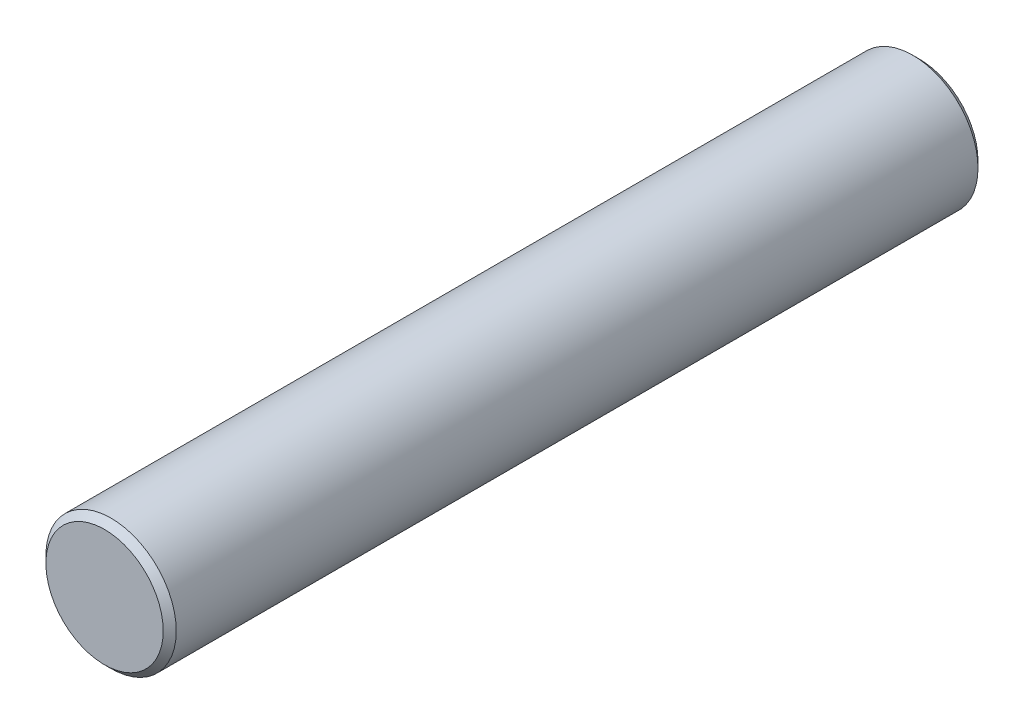
ISO-10303-21;
HEADER;
FILE_DESCRIPTION(('STEP AP214'),'2;1');
FILE_NAME('part.step','',(''),(''),'','','');
FILE_SCHEMA(('AUTOMOTIVE_DESIGN { 1 0 10303 214 1 1 1 1 }'));
ENDSEC;
DATA;
#1=APPLICATION_CONTEXT('core data for automotive mechanical design processes');
#2=APPLICATION_PROTOCOL_DEFINITION('international standard','automotive_design',2000,#1);
#3=PRODUCT_CONTEXT('',#1,'mechanical');
#4=PRODUCT('Part','Part','',(#3));
#5=PRODUCT_RELATED_PRODUCT_CATEGORY('part','',(#4));
#6=PRODUCT_DEFINITION_FORMATION('','',#4);
#7=PRODUCT_DEFINITION_CONTEXT('part definition',#1,'design');
#8=PRODUCT_DEFINITION('design','',#6,#7);
#9=PRODUCT_DEFINITION_SHAPE('','',#8);
#10=(LENGTH_UNIT() NAMED_UNIT(*) SI_UNIT(.MILLI.,.METRE.));
#11=(NAMED_UNIT(*) PLANE_ANGLE_UNIT() SI_UNIT($,.RADIAN.));
#12=(NAMED_UNIT(*) SI_UNIT($,.STERADIAN.) SOLID_ANGLE_UNIT());
#13=UNCERTAINTY_MEASURE_WITH_UNIT(LENGTH_MEASURE(1.E-05),#10,'distance_accuracy_value','');
#14=(GEOMETRIC_REPRESENTATION_CONTEXT(3) GLOBAL_UNCERTAINTY_ASSIGNED_CONTEXT((#13)) GLOBAL_UNIT_ASSIGNED_CONTEXT((#10,
#11,#12)) REPRESENTATION_CONTEXT('',''));
#15=CARTESIAN_POINT('',(0.,0.,0.));
#16=DIRECTION('',(0.,0.,1.));
#17=DIRECTION('',(1.,0.,0.));
#18=AXIS2_PLACEMENT_3D('',#15,#16,#17);
#19=CARTESIAN_POINT('',(0.,0.,125.));
#20=DIRECTION('',(0.,0.,-1.));
#21=DIRECTION('',(-1.,0.,0.));
#22=AXIS2_PLACEMENT_3D('',#19,#20,#21);
#23=CYLINDRICAL_SURFACE('',#22,10.);
#24=CARTESIAN_POINT('',(0.,0.,124.));
#25=DIRECTION('',(0.,0.,1.));
#26=DIRECTION('',(1.,0.,0.));
#27=AXIS2_PLACEMENT_3D('',#24,#25,#26);
#28=CIRCLE('',#27,10.);
#29=CARTESIAN_POINT('',(10.,0.,124.));
#30=VERTEX_POINT('',#29);
#31=EDGE_CURVE('E39',#30,#30,#28,.F.);
#32=ORIENTED_EDGE('',*,*,#31,.T.);
#33=EDGE_LOOP('',(#32));
#34=FACE_BOUND('',#33,.T.);
#35=CARTESIAN_POINT('',(0.,0.,0.999999999999987));
#36=DIRECTION('',(0.,0.,1.));
#37=DIRECTION('',(1.,0.,0.));
#38=AXIS2_PLACEMENT_3D('',#35,#36,#37);
#39=CIRCLE('',#38,10.);
#40=CARTESIAN_POINT('',(10.,0.,0.999999999999987));
#41=VERTEX_POINT('',#40);
#42=EDGE_CURVE('E43',#41,#41,#39,.T.);
#43=ORIENTED_EDGE('',*,*,#42,.T.);
#44=EDGE_LOOP('',(#43));
#45=FACE_BOUND('',#44,.T.);
#46=ADVANCED_FACE('F32',(#34,#45),#23,.T.);
#47=CARTESIAN_POINT('',(0.,0.,125.));
#48=DIRECTION('',(0.,0.,1.));
#49=DIRECTION('',(1.,0.,0.));
#50=AXIS2_PLACEMENT_3D('',#47,#48,#49);
#51=PLANE('',#50);
#52=CARTESIAN_POINT('',(0.,0.,125.));
#53=DIRECTION('',(0.,0.,1.));
#54=DIRECTION('',(1.,0.,0.));
#55=AXIS2_PLACEMENT_3D('',#52,#53,#54);
#56=CIRCLE('',#55,8.99999999999999);
#57=CARTESIAN_POINT('',(8.99999999999999,0.,125.));
#58=VERTEX_POINT('',#57);
#59=EDGE_CURVE('E47',#58,#58,#56,.T.);
#60=ORIENTED_EDGE('',*,*,#59,.T.);
#61=EDGE_LOOP('',(#60));
#62=FACE_BOUND('',#61,.T.);
#63=ADVANCED_FACE('F53',(#62),#51,.T.);
#64=CARTESIAN_POINT('',(0.,0.,0.));
#65=DIRECTION('',(0.,0.,1.));
#66=DIRECTION('',(1.,0.,0.));
#67=AXIS2_PLACEMENT_3D('',#64,#65,#66);
#68=PLANE('',#67);
#69=CARTESIAN_POINT('',(0.,0.,0.));
#70=DIRECTION('',(0.,0.,1.));
#71=DIRECTION('',(1.,0.,0.));
#72=AXIS2_PLACEMENT_3D('',#69,#70,#71);
#73=CIRCLE('',#72,9.00000000000001);
#74=CARTESIAN_POINT('',(9.00000000000001,0.,0.));
#75=VERTEX_POINT('',#74);
#76=EDGE_CURVE('E10',#75,#75,#73,.F.);
#77=ORIENTED_EDGE('',*,*,#76,.T.);
#78=EDGE_LOOP('',(#77));
#79=FACE_BOUND('',#78,.T.);
#80=ADVANCED_FACE('F57',(#79),#68,.F.);
#81=CARTESIAN_POINT('',(0.,0.,125.));
#82=DIRECTION('',(0.,0.,-1.));
#83=DIRECTION('',(-1.,0.,0.));
#84=AXIS2_PLACEMENT_3D('',#81,#82,#83);
#85=CONICAL_SURFACE('',#84,8.99999999999999,0.785398163397437);
#86=ORIENTED_EDGE('',*,*,#31,.F.);
#87=EDGE_LOOP('',(#86));
#88=FACE_BOUND('',#87,.T.);
#89=ORIENTED_EDGE('',*,*,#59,.F.);
#90=EDGE_LOOP('',(#89));
#91=FACE_BOUND('',#90,.T.);
#92=ADVANCED_FACE('F55',(#88,#91),#85,.T.);
#93=CARTESIAN_POINT('',(0.,0.,0.999999999999987));
#94=DIRECTION('',(0.,0.,1.));
#95=DIRECTION('',(1.,0.,0.));
#96=AXIS2_PLACEMENT_3D('',#93,#94,#95);
#97=CONICAL_SURFACE('',#96,10.,0.785398163397451);
#98=ORIENTED_EDGE('',*,*,#76,.F.);
#99=EDGE_LOOP('',(#98));
#100=FACE_BOUND('',#99,.T.);
#101=ORIENTED_EDGE('',*,*,#42,.F.);
#102=EDGE_LOOP('',(#101));
#103=FACE_BOUND('',#102,.T.);
#104=ADVANCED_FACE('F34',(#100,#103),#97,.T.);
#105=CLOSED_SHELL('',(#46,#63,#80,#92,#104));
#106=MANIFOLD_SOLID_BREP('B2',#105);
#107=ADVANCED_BREP_SHAPE_REPRESENTATION('',(#18,#106),#14);
#108=SHAPE_DEFINITION_REPRESENTATION(#9,#107);
ENDSEC;
END-ISO-10303-21;
